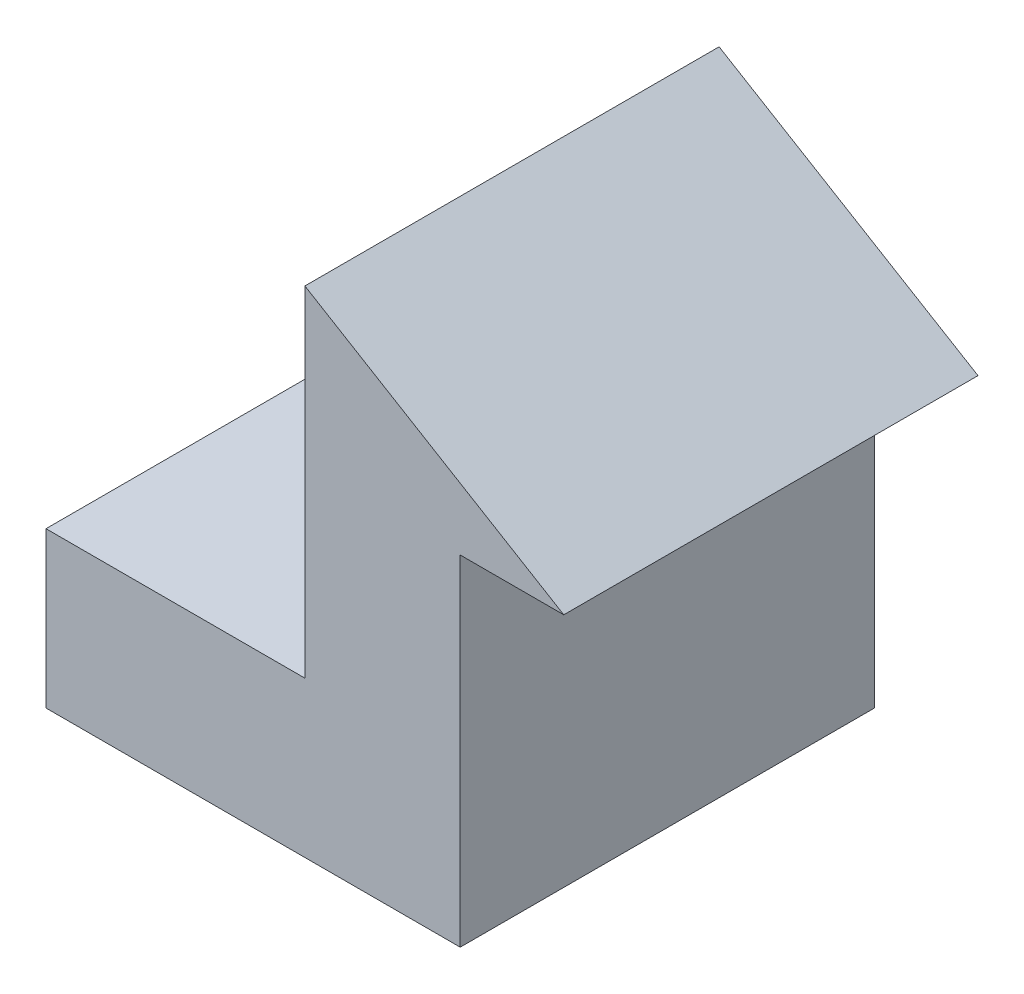
ISO-10303-21;
HEADER;
FILE_DESCRIPTION(('STEP AP214'),'2;1');
FILE_NAME('part.step','',(''),(''),'','','');
FILE_SCHEMA(('AUTOMOTIVE_DESIGN { 1 0 10303 214 1 1 1 1 }'));
ENDSEC;
DATA;
#1=APPLICATION_CONTEXT('core data for automotive mechanical design processes');
#2=APPLICATION_PROTOCOL_DEFINITION('international standard','automotive_design',2000,#1);
#3=PRODUCT_CONTEXT('',#1,'mechanical');
#4=PRODUCT('Part','Part','',(#3));
#5=PRODUCT_RELATED_PRODUCT_CATEGORY('part','',(#4));
#6=PRODUCT_DEFINITION_FORMATION('','',#4);
#7=PRODUCT_DEFINITION_CONTEXT('part definition',#1,'design');
#8=PRODUCT_DEFINITION('design','',#6,#7);
#9=PRODUCT_DEFINITION_SHAPE('','',#8);
#10=(LENGTH_UNIT() NAMED_UNIT(*) SI_UNIT(.MILLI.,.METRE.));
#11=(NAMED_UNIT(*) PLANE_ANGLE_UNIT() SI_UNIT($,.RADIAN.));
#12=(NAMED_UNIT(*) SI_UNIT($,.STERADIAN.) SOLID_ANGLE_UNIT());
#13=UNCERTAINTY_MEASURE_WITH_UNIT(LENGTH_MEASURE(1.E-05),#10,'distance_accuracy_value','');
#14=(GEOMETRIC_REPRESENTATION_CONTEXT(3) GLOBAL_UNCERTAINTY_ASSIGNED_CONTEXT((#13)) GLOBAL_UNIT_ASSIGNED_CONTEXT((#10,
#11,#12)) REPRESENTATION_CONTEXT('',''));
#15=CARTESIAN_POINT('',(0.,0.,0.));
#16=DIRECTION('',(0.,0.,1.));
#17=DIRECTION('',(1.,0.,0.));
#18=AXIS2_PLACEMENT_3D('',#15,#16,#17);
#19=CARTESIAN_POINT('',(40.,0.,40.));
#20=DIRECTION('',(-1.,0.,0.));
#21=DIRECTION('',(0.,0.,1.));
#22=AXIS2_PLACEMENT_3D('',#19,#20,#21);
#23=PLANE('',#22);
#24=DIRECTION('',(0.,1.,0.));
#25=VECTOR('',#24,1.);
#26=CARTESIAN_POINT('',(40.,0.,0.));
#27=LINE('',#26,#25);
#28=CARTESIAN_POINT('',(40.,0.,0.));
#29=VERTEX_POINT('',#28);
#30=CARTESIAN_POINT('',(40.,32.8,0.));
#31=VERTEX_POINT('',#30);
#32=EDGE_CURVE('E105',#29,#31,#27,.T.);
#33=ORIENTED_EDGE('',*,*,#32,.T.);
#34=DIRECTION('',(0.,0.,-1.));
#35=VECTOR('',#34,1.);
#36=CARTESIAN_POINT('',(40.,32.8,40.));
#37=LINE('',#36,#35);
#38=CARTESIAN_POINT('',(40.,32.8,40.));
#39=VERTEX_POINT('',#38);
#40=EDGE_CURVE('E155',#39,#31,#37,.T.);
#41=ORIENTED_EDGE('',*,*,#40,.F.);
#42=DIRECTION('',(0.,1.,0.));
#43=VECTOR('',#42,1.);
#44=CARTESIAN_POINT('',(40.,0.,40.));
#45=LINE('',#44,#43);
#46=CARTESIAN_POINT('',(40.,0.,40.));
#47=VERTEX_POINT('',#46);
#48=EDGE_CURVE('E111',#47,#39,#45,.T.);
#49=ORIENTED_EDGE('',*,*,#48,.F.);
#50=DIRECTION('',(0.,0.,-1.));
#51=VECTOR('',#50,1.);
#52=CARTESIAN_POINT('',(40.,0.,40.));
#53=LINE('',#52,#51);
#54=EDGE_CURVE('E74',#47,#29,#53,.T.);
#55=ORIENTED_EDGE('',*,*,#54,.T.);
#56=EDGE_LOOP('',(#33,#41,#49,#55));
#57=FACE_BOUND('',#56,.T.);
#58=ADVANCED_FACE('F65',(#57),#23,.F.);
#59=CARTESIAN_POINT('',(0.,0.,40.));
#60=DIRECTION('',(-1.,0.,0.));
#61=DIRECTION('',(0.,0.,1.));
#62=AXIS2_PLACEMENT_3D('',#59,#60,#61);
#63=PLANE('',#62);
#64=DIRECTION('',(0.,1.,0.));
#65=VECTOR('',#64,1.);
#66=CARTESIAN_POINT('',(0.,0.,0.));
#67=LINE('',#66,#65);
#68=CARTESIAN_POINT('',(0.,0.,0.));
#69=VERTEX_POINT('',#68);
#70=CARTESIAN_POINT('',(0.,15.,0.));
#71=VERTEX_POINT('',#70);
#72=EDGE_CURVE('E144',#69,#71,#67,.T.);
#73=ORIENTED_EDGE('',*,*,#72,.F.);
#74=DIRECTION('',(0.,0.,-1.));
#75=VECTOR('',#74,1.);
#76=CARTESIAN_POINT('',(0.,0.,40.));
#77=LINE('',#76,#75);
#78=CARTESIAN_POINT('',(0.,0.,40.));
#79=VERTEX_POINT('',#78);
#80=EDGE_CURVE('E128',#79,#69,#77,.T.);
#81=ORIENTED_EDGE('',*,*,#80,.F.);
#82=DIRECTION('',(0.,1.,0.));
#83=VECTOR('',#82,1.);
#84=CARTESIAN_POINT('',(0.,0.,40.));
#85=LINE('',#84,#83);
#86=CARTESIAN_POINT('',(0.,15.,40.));
#87=VERTEX_POINT('',#86);
#88=EDGE_CURVE('E142',#79,#87,#85,.T.);
#89=ORIENTED_EDGE('',*,*,#88,.T.);
#90=DIRECTION('',(0.,0.,-1.));
#91=VECTOR('',#90,1.);
#92=CARTESIAN_POINT('',(0.,15.,40.));
#93=LINE('',#92,#91);
#94=EDGE_CURVE('E137',#87,#71,#93,.T.);
#95=ORIENTED_EDGE('',*,*,#94,.T.);
#96=EDGE_LOOP('',(#73,#81,#89,#95));
#97=FACE_BOUND('',#96,.T.);
#98=ADVANCED_FACE('F141',(#97),#63,.T.);
#99=CARTESIAN_POINT('',(0.,0.,40.));
#100=DIRECTION('',(0.,1.,0.));
#101=DIRECTION('',(0.,0.,1.));
#102=AXIS2_PLACEMENT_3D('',#99,#100,#101);
#103=PLANE('',#102);
#104=DIRECTION('',(1.,0.,0.));
#105=VECTOR('',#104,1.);
#106=CARTESIAN_POINT('',(0.,0.,0.));
#107=LINE('',#106,#105);
#108=EDGE_CURVE('E119',#69,#29,#107,.T.);
#109=ORIENTED_EDGE('',*,*,#108,.T.);
#110=ORIENTED_EDGE('',*,*,#54,.F.);
#111=DIRECTION('',(1.,0.,0.));
#112=VECTOR('',#111,1.);
#113=CARTESIAN_POINT('',(0.,0.,40.));
#114=LINE('',#113,#112);
#115=EDGE_CURVE('E132',#79,#47,#114,.T.);
#116=ORIENTED_EDGE('',*,*,#115,.F.);
#117=ORIENTED_EDGE('',*,*,#80,.T.);
#118=EDGE_LOOP('',(#109,#110,#116,#117));
#119=FACE_BOUND('',#118,.T.);
#120=ADVANCED_FACE('F146',(#119),#103,.F.);
#121=CARTESIAN_POINT('',(0.,15.,40.));
#122=DIRECTION('',(0.,1.,0.));
#123=DIRECTION('',(0.,0.,1.));
#124=AXIS2_PLACEMENT_3D('',#121,#122,#123);
#125=PLANE('',#124);
#126=DIRECTION('',(0.,0.,1.));
#127=VECTOR('',#126,1.);
#128=CARTESIAN_POINT('',(25.,15.,40.));
#129=LINE('',#128,#127);
#130=CARTESIAN_POINT('',(25.,15.,0.));
#131=VERTEX_POINT('',#130);
#132=CARTESIAN_POINT('',(25.,15.,40.));
#133=VERTEX_POINT('',#132);
#134=EDGE_CURVE('E12',#131,#133,#129,.T.);
#135=ORIENTED_EDGE('',*,*,#134,.F.);
#136=DIRECTION('',(1.,0.,0.));
#137=VECTOR('',#136,1.);
#138=CARTESIAN_POINT('',(0.,15.,0.));
#139=LINE('',#138,#137);
#140=EDGE_CURVE('E157',#71,#131,#139,.T.);
#141=ORIENTED_EDGE('',*,*,#140,.F.);
#142=ORIENTED_EDGE('',*,*,#94,.F.);
#143=DIRECTION('',(1.,0.,0.));
#144=VECTOR('',#143,1.);
#145=CARTESIAN_POINT('',(0.,15.,40.));
#146=LINE('',#145,#144);
#147=EDGE_CURVE('E149',#87,#133,#146,.T.);
#148=ORIENTED_EDGE('',*,*,#147,.T.);
#149=EDGE_LOOP('',(#135,#141,#142,#148));
#150=FACE_BOUND('',#149,.T.);
#151=ADVANCED_FACE('F193',(#150),#125,.T.);
#152=CARTESIAN_POINT('',(0.,0.,0.));
#153=DIRECTION('',(0.,0.,1.));
#154=DIRECTION('',(1.,0.,0.));
#155=AXIS2_PLACEMENT_3D('',#152,#153,#154);
#156=PLANE('',#155);
#157=ORIENTED_EDGE('',*,*,#140,.T.);
#158=DIRECTION('',(0.,1.,0.));
#159=VECTOR('',#158,1.);
#160=CARTESIAN_POINT('',(25.,0.,0.));
#161=LINE('',#160,#159);
#162=CARTESIAN_POINT('',(25.,47.8,0.));
#163=VERTEX_POINT('',#162);
#164=EDGE_CURVE('E171',#131,#163,#161,.T.);
#165=ORIENTED_EDGE('',*,*,#164,.T.);
#166=DIRECTION('',(0.857492925712544,-0.514495755427526,0.));
#167=VECTOR('',#166,1.);
#168=CARTESIAN_POINT('',(27.7058823529412,46.1764705882353,0.));
#169=LINE('',#168,#167);
#170=CARTESIAN_POINT('',(50.,32.8,0.));
#171=VERTEX_POINT('',#170);
#172=EDGE_CURVE('E165',#163,#171,#169,.T.);
#173=ORIENTED_EDGE('',*,*,#172,.T.);
#174=DIRECTION('',(1.,0.,0.));
#175=VECTOR('',#174,1.);
#176=CARTESIAN_POINT('',(0.,32.8,0.));
#177=LINE('',#176,#175);
#178=EDGE_CURVE('E174',#31,#171,#177,.T.);
#179=ORIENTED_EDGE('',*,*,#178,.F.);
#180=ORIENTED_EDGE('',*,*,#32,.F.);
#181=ORIENTED_EDGE('',*,*,#108,.F.);
#182=ORIENTED_EDGE('',*,*,#72,.T.);
#183=EDGE_LOOP('',(#157,#165,#173,#179,#180,#181,#182));
#184=FACE_BOUND('',#183,.T.);
#185=ADVANCED_FACE('F187',(#184),#156,.F.);
#186=CARTESIAN_POINT('',(0.,0.,40.));
#187=DIRECTION('',(0.,0.,1.));
#188=DIRECTION('',(1.,0.,0.));
#189=AXIS2_PLACEMENT_3D('',#186,#187,#188);
#190=PLANE('',#189);
#191=ORIENTED_EDGE('',*,*,#115,.T.);
#192=ORIENTED_EDGE('',*,*,#48,.T.);
#193=DIRECTION('',(1.,0.,0.));
#194=VECTOR('',#193,1.);
#195=CARTESIAN_POINT('',(0.,32.8,40.));
#196=LINE('',#195,#194);
#197=CARTESIAN_POINT('',(50.,32.8,40.));
#198=VERTEX_POINT('',#197);
#199=EDGE_CURVE('E164',#39,#198,#196,.T.);
#200=ORIENTED_EDGE('',*,*,#199,.T.);
#201=DIRECTION('',(0.857492925712544,-0.514495755427526,0.));
#202=VECTOR('',#201,1.);
#203=CARTESIAN_POINT('',(27.7058823529412,46.1764705882353,40.));
#204=LINE('',#203,#202);
#205=CARTESIAN_POINT('',(25.,47.8,40.));
#206=VERTEX_POINT('',#205);
#207=EDGE_CURVE('E167',#206,#198,#204,.T.);
#208=ORIENTED_EDGE('',*,*,#207,.F.);
#209=DIRECTION('',(0.,1.,0.));
#210=VECTOR('',#209,1.);
#211=CARTESIAN_POINT('',(25.,0.,40.));
#212=LINE('',#211,#210);
#213=EDGE_CURVE('E82',#133,#206,#212,.T.);
#214=ORIENTED_EDGE('',*,*,#213,.F.);
#215=ORIENTED_EDGE('',*,*,#147,.F.);
#216=ORIENTED_EDGE('',*,*,#88,.F.);
#217=EDGE_LOOP('',(#191,#192,#200,#208,#214,#215,#216));
#218=FACE_BOUND('',#217,.T.);
#219=ADVANCED_FACE('F148',(#218),#190,.T.);
#220=CARTESIAN_POINT('',(27.7058823529412,46.1764705882353,40.));
#221=DIRECTION('',(0.514495755427526,0.857492925712544,0.));
#222=DIRECTION('',(-0.857492925712544,0.514495755427526,0.));
#223=AXIS2_PLACEMENT_3D('',#220,#221,#222);
#224=PLANE('',#223);
#225=ORIENTED_EDGE('',*,*,#172,.F.);
#226=DIRECTION('',(0.,0.,-1.));
#227=VECTOR('',#226,1.);
#228=CARTESIAN_POINT('',(25.,47.8,40.));
#229=LINE('',#228,#227);
#230=EDGE_CURVE('E170',#206,#163,#229,.T.);
#231=ORIENTED_EDGE('',*,*,#230,.F.);
#232=ORIENTED_EDGE('',*,*,#207,.T.);
#233=DIRECTION('',(0.,0.,-1.));
#234=VECTOR('',#233,1.);
#235=CARTESIAN_POINT('',(50.,32.8,40.));
#236=LINE('',#235,#234);
#237=EDGE_CURVE('E179',#198,#171,#236,.T.);
#238=ORIENTED_EDGE('',*,*,#237,.T.);
#239=EDGE_LOOP('',(#225,#231,#232,#238));
#240=FACE_BOUND('',#239,.T.);
#241=ADVANCED_FACE('F190',(#240),#224,.T.);
#242=CARTESIAN_POINT('',(0.,32.8,40.));
#243=DIRECTION('',(0.,1.,0.));
#244=DIRECTION('',(0.,0.,1.));
#245=AXIS2_PLACEMENT_3D('',#242,#243,#244);
#246=PLANE('',#245);
#247=ORIENTED_EDGE('',*,*,#199,.F.);
#248=ORIENTED_EDGE('',*,*,#40,.T.);
#249=ORIENTED_EDGE('',*,*,#178,.T.);
#250=ORIENTED_EDGE('',*,*,#237,.F.);
#251=EDGE_LOOP('',(#247,#248,#249,#250));
#252=FACE_BOUND('',#251,.T.);
#253=ADVANCED_FACE('F184',(#252),#246,.F.);
#254=CARTESIAN_POINT('',(25.,0.,40.));
#255=DIRECTION('',(-1.,0.,0.));
#256=DIRECTION('',(0.,0.,1.));
#257=AXIS2_PLACEMENT_3D('',#254,#255,#256);
#258=PLANE('',#257);
#259=ORIENTED_EDGE('',*,*,#164,.F.);
#260=ORIENTED_EDGE('',*,*,#134,.T.);
#261=ORIENTED_EDGE('',*,*,#213,.T.);
#262=ORIENTED_EDGE('',*,*,#230,.T.);
#263=EDGE_LOOP('',(#259,#260,#261,#262));
#264=FACE_BOUND('',#263,.T.);
#265=ADVANCED_FACE('F67',(#264),#258,.T.);
#266=CLOSED_SHELL('',(#58,#98,#120,#151,#185,#219,#241,#253,#265));
#267=MANIFOLD_SOLID_BREP('B2',#266);
#268=ADVANCED_BREP_SHAPE_REPRESENTATION('',(#18,#267),#14);
#269=SHAPE_DEFINITION_REPRESENTATION(#9,#268);
ENDSEC;
END-ISO-10303-21;
